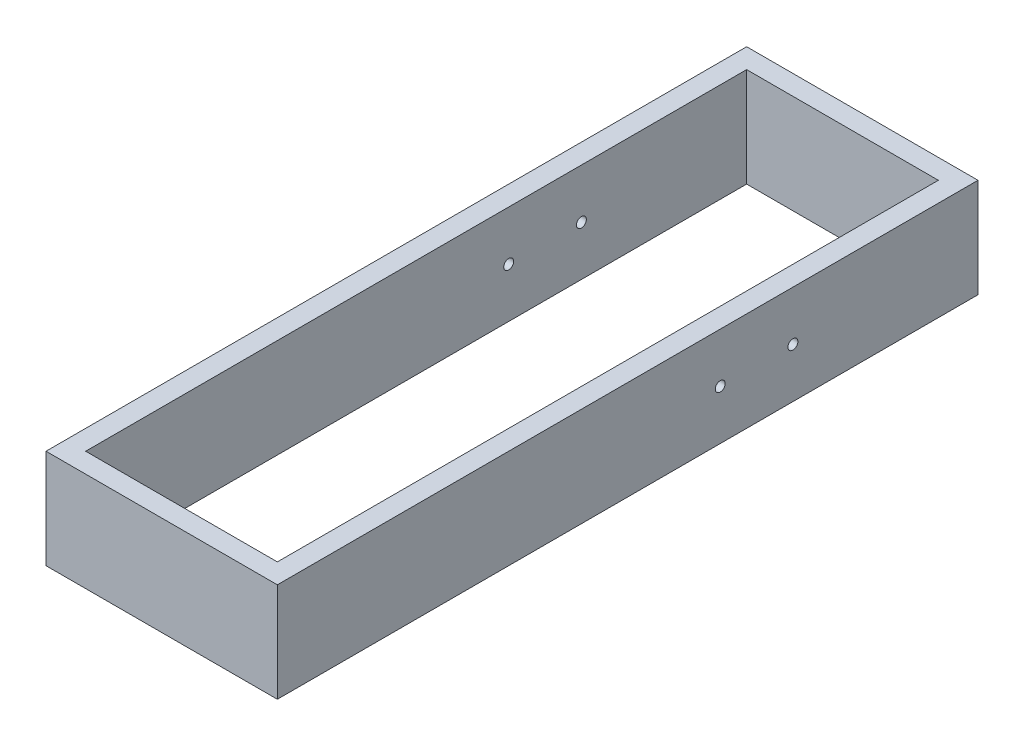
ISO-10303-21;
HEADER;
FILE_DESCRIPTION(('STEP AP214'),'2;1');
FILE_NAME('part.step','',(''),(''),'','','');
FILE_SCHEMA(('AUTOMOTIVE_DESIGN { 1 0 10303 214 1 1 1 1 }'));
ENDSEC;
DATA;
#1=APPLICATION_CONTEXT('core data for automotive mechanical design processes');
#2=APPLICATION_PROTOCOL_DEFINITION('international standard','automotive_design',2000,#1);
#3=PRODUCT_CONTEXT('',#1,'mechanical');
#4=PRODUCT('Part','Part','',(#3));
#5=PRODUCT_RELATED_PRODUCT_CATEGORY('part','',(#4));
#6=PRODUCT_DEFINITION_FORMATION('','',#4);
#7=PRODUCT_DEFINITION_CONTEXT('part definition',#1,'design');
#8=PRODUCT_DEFINITION('design','',#6,#7);
#9=PRODUCT_DEFINITION_SHAPE('','',#8);
#10=(LENGTH_UNIT() NAMED_UNIT(*) SI_UNIT(.MILLI.,.METRE.));
#11=(NAMED_UNIT(*) PLANE_ANGLE_UNIT() SI_UNIT($,.RADIAN.));
#12=(NAMED_UNIT(*) SI_UNIT($,.STERADIAN.) SOLID_ANGLE_UNIT());
#13=UNCERTAINTY_MEASURE_WITH_UNIT(LENGTH_MEASURE(1.E-05),#10,'distance_accuracy_value','');
#14=(GEOMETRIC_REPRESENTATION_CONTEXT(3) GLOBAL_UNCERTAINTY_ASSIGNED_CONTEXT((#13)) GLOBAL_UNIT_ASSIGNED_CONTEXT((#10,
#11,#12)) REPRESENTATION_CONTEXT('',''));
#15=CARTESIAN_POINT('',(0.,0.,0.));
#16=DIRECTION('',(0.,0.,1.));
#17=DIRECTION('',(1.,0.,0.));
#18=AXIS2_PLACEMENT_3D('',#15,#16,#17);
#19=CARTESIAN_POINT('',(0.,30.,0.));
#20=DIRECTION('',(0.,1.,0.));
#21=DIRECTION('',(0.,0.,1.));
#22=AXIS2_PLACEMENT_3D('',#19,#20,#21);
#23=PLANE('',#22);
#24=DIRECTION('',(0.,0.,-1.));
#25=VECTOR('',#24,1.);
#26=CARTESIAN_POINT('',(35.,30.,-106.));
#27=LINE('',#26,#25);
#28=CARTESIAN_POINT('',(35.,30.,106.));
#29=VERTEX_POINT('',#28);
#30=CARTESIAN_POINT('',(35.,30.,-106.));
#31=VERTEX_POINT('',#30);
#32=EDGE_CURVE('E140',#29,#31,#27,.T.);
#33=ORIENTED_EDGE('',*,*,#32,.T.);
#34=DIRECTION('',(-1.,0.,0.));
#35=VECTOR('',#34,1.);
#36=CARTESIAN_POINT('',(-35.,30.,-106.));
#37=LINE('',#36,#35);
#38=CARTESIAN_POINT('',(-35.,30.,-106.));
#39=VERTEX_POINT('',#38);
#40=EDGE_CURVE('E143',#31,#39,#37,.T.);
#41=ORIENTED_EDGE('',*,*,#40,.T.);
#42=DIRECTION('',(0.,0.,1.));
#43=VECTOR('',#42,1.);
#44=CARTESIAN_POINT('',(-35.,30.,-106.));
#45=LINE('',#44,#43);
#46=CARTESIAN_POINT('',(-35.,30.,106.));
#47=VERTEX_POINT('',#46);
#48=EDGE_CURVE('E146',#39,#47,#45,.T.);
#49=ORIENTED_EDGE('',*,*,#48,.T.);
#50=DIRECTION('',(1.,0.,0.));
#51=VECTOR('',#50,1.);
#52=CARTESIAN_POINT('',(-35.,30.,106.));
#53=LINE('',#52,#51);
#54=EDGE_CURVE('E148',#47,#29,#53,.T.);
#55=ORIENTED_EDGE('',*,*,#54,.T.);
#56=EDGE_LOOP('',(#33,#41,#49,#55));
#57=FACE_BOUND('',#56,.T.);
#58=DIRECTION('',(-1.,0.,0.));
#59=VECTOR('',#58,1.);
#60=CARTESIAN_POINT('',(-29.,30.,-100.));
#61=LINE('',#60,#59);
#62=CARTESIAN_POINT('',(29.,30.,-100.));
#63=VERTEX_POINT('',#62);
#64=CARTESIAN_POINT('',(-29.,30.,-100.));
#65=VERTEX_POINT('',#64);
#66=EDGE_CURVE('E110',#63,#65,#61,.T.);
#67=ORIENTED_EDGE('',*,*,#66,.F.);
#68=DIRECTION('',(0.,0.,-1.));
#69=VECTOR('',#68,1.);
#70=CARTESIAN_POINT('',(29.,30.,-100.));
#71=LINE('',#70,#69);
#72=CARTESIAN_POINT('',(29.,30.,100.));
#73=VERTEX_POINT('',#72);
#74=EDGE_CURVE('E102',#73,#63,#71,.T.);
#75=ORIENTED_EDGE('',*,*,#74,.F.);
#76=DIRECTION('',(1.,0.,0.));
#77=VECTOR('',#76,1.);
#78=CARTESIAN_POINT('',(-29.,30.,100.));
#79=LINE('',#78,#77);
#80=CARTESIAN_POINT('',(-29.,30.,100.));
#81=VERTEX_POINT('',#80);
#82=EDGE_CURVE('E124',#81,#73,#79,.T.);
#83=ORIENTED_EDGE('',*,*,#82,.F.);
#84=DIRECTION('',(0.,0.,1.));
#85=VECTOR('',#84,1.);
#86=CARTESIAN_POINT('',(-29.,30.,-100.));
#87=LINE('',#86,#85);
#88=EDGE_CURVE('E122',#65,#81,#87,.T.);
#89=ORIENTED_EDGE('',*,*,#88,.F.);
#90=EDGE_LOOP('',(#67,#75,#83,#89));
#91=FACE_BOUND('',#90,.T.);
#92=ADVANCED_FACE('F35',(#57,#91),#23,.T.);
#93=CARTESIAN_POINT('',(0.,0.,0.));
#94=DIRECTION('',(0.,1.,0.));
#95=DIRECTION('',(0.,0.,1.));
#96=AXIS2_PLACEMENT_3D('',#93,#94,#95);
#97=PLANE('',#96);
#98=DIRECTION('',(0.,0.,-1.));
#99=VECTOR('',#98,1.);
#100=CARTESIAN_POINT('',(35.,0.,-106.));
#101=LINE('',#100,#99);
#102=CARTESIAN_POINT('',(35.,0.,106.));
#103=VERTEX_POINT('',#102);
#104=CARTESIAN_POINT('',(35.,0.,-106.));
#105=VERTEX_POINT('',#104);
#106=EDGE_CURVE('E118',#103,#105,#101,.T.);
#107=ORIENTED_EDGE('',*,*,#106,.F.);
#108=DIRECTION('',(1.,0.,0.));
#109=VECTOR('',#108,1.);
#110=CARTESIAN_POINT('',(-35.,0.,106.));
#111=LINE('',#110,#109);
#112=CARTESIAN_POINT('',(-35.,0.,106.));
#113=VERTEX_POINT('',#112);
#114=EDGE_CURVE('E144',#113,#103,#111,.T.);
#115=ORIENTED_EDGE('',*,*,#114,.F.);
#116=DIRECTION('',(0.,0.,1.));
#117=VECTOR('',#116,1.);
#118=CARTESIAN_POINT('',(-35.,0.,-106.));
#119=LINE('',#118,#117);
#120=CARTESIAN_POINT('',(-35.,0.,-106.));
#121=VERTEX_POINT('',#120);
#122=EDGE_CURVE('E155',#121,#113,#119,.T.);
#123=ORIENTED_EDGE('',*,*,#122,.F.);
#124=DIRECTION('',(-1.,0.,0.));
#125=VECTOR('',#124,1.);
#126=CARTESIAN_POINT('',(-35.,0.,-106.));
#127=LINE('',#126,#125);
#128=EDGE_CURVE('E153',#105,#121,#127,.T.);
#129=ORIENTED_EDGE('',*,*,#128,.F.);
#130=EDGE_LOOP('',(#107,#115,#123,#129));
#131=FACE_BOUND('',#130,.T.);
#132=DIRECTION('',(0.,0.,-1.));
#133=VECTOR('',#132,1.);
#134=CARTESIAN_POINT('',(29.,0.,-100.));
#135=LINE('',#134,#133);
#136=CARTESIAN_POINT('',(29.,0.,100.));
#137=VERTEX_POINT('',#136);
#138=CARTESIAN_POINT('',(29.,0.,-100.));
#139=VERTEX_POINT('',#138);
#140=EDGE_CURVE('E60',#137,#139,#135,.T.);
#141=ORIENTED_EDGE('',*,*,#140,.T.);
#142=DIRECTION('',(-1.,0.,0.));
#143=VECTOR('',#142,1.);
#144=CARTESIAN_POINT('',(-29.,0.,-100.));
#145=LINE('',#144,#143);
#146=CARTESIAN_POINT('',(-29.,0.,-100.));
#147=VERTEX_POINT('',#146);
#148=EDGE_CURVE('E117',#139,#147,#145,.T.);
#149=ORIENTED_EDGE('',*,*,#148,.T.);
#150=DIRECTION('',(0.,0.,1.));
#151=VECTOR('',#150,1.);
#152=CARTESIAN_POINT('',(-29.,0.,-100.));
#153=LINE('',#152,#151);
#154=CARTESIAN_POINT('',(-29.,0.,100.));
#155=VERTEX_POINT('',#154);
#156=EDGE_CURVE('E132',#147,#155,#153,.T.);
#157=ORIENTED_EDGE('',*,*,#156,.T.);
#158=DIRECTION('',(1.,0.,0.));
#159=VECTOR('',#158,1.);
#160=CARTESIAN_POINT('',(-29.,0.,100.));
#161=LINE('',#160,#159);
#162=EDGE_CURVE('E111',#155,#137,#161,.T.);
#163=ORIENTED_EDGE('',*,*,#162,.T.);
#164=EDGE_LOOP('',(#141,#149,#157,#163));
#165=FACE_BOUND('',#164,.T.);
#166=ADVANCED_FACE('F202',(#131,#165),#97,.F.);
#167=CARTESIAN_POINT('',(35.,30.,-106.));
#168=DIRECTION('',(-1.,0.,0.));
#169=DIRECTION('',(0.,0.,1.));
#170=AXIS2_PLACEMENT_3D('',#167,#168,#169);
#171=PLANE('',#170);
#172=CARTESIAN_POINT('',(35.,15.,-50.));
#173=DIRECTION('',(1.,0.,0.));
#174=DIRECTION('',(0.,0.,-1.));
#175=AXIS2_PLACEMENT_3D('',#172,#173,#174);
#176=CIRCLE('',#175,1.5);
#177=CARTESIAN_POINT('',(35.,15.,-51.5));
#178=VERTEX_POINT('',#177);
#179=EDGE_CURVE('E173',#178,#178,#176,.T.);
#180=ORIENTED_EDGE('',*,*,#179,.F.);
#181=EDGE_LOOP('',(#180));
#182=FACE_BOUND('',#181,.T.);
#183=CARTESIAN_POINT('',(35.,15.,-28.));
#184=DIRECTION('',(1.,0.,0.));
#185=DIRECTION('',(0.,0.,-1.));
#186=AXIS2_PLACEMENT_3D('',#183,#184,#185);
#187=CIRCLE('',#186,1.5);
#188=CARTESIAN_POINT('',(35.,15.,-29.5));
#189=VERTEX_POINT('',#188);
#190=EDGE_CURVE('E183',#189,#189,#187,.T.);
#191=ORIENTED_EDGE('',*,*,#190,.F.);
#192=EDGE_LOOP('',(#191));
#193=FACE_BOUND('',#192,.T.);
#194=ORIENTED_EDGE('',*,*,#106,.T.);
#195=DIRECTION('',(0.,-1.,0.));
#196=VECTOR('',#195,1.);
#197=CARTESIAN_POINT('',(35.,30.,-106.));
#198=LINE('',#197,#196);
#199=EDGE_CURVE('E11',#31,#105,#198,.T.);
#200=ORIENTED_EDGE('',*,*,#199,.F.);
#201=ORIENTED_EDGE('',*,*,#32,.F.);
#202=DIRECTION('',(0.,-1.,0.));
#203=VECTOR('',#202,1.);
#204=CARTESIAN_POINT('',(35.,30.,106.));
#205=LINE('',#204,#203);
#206=EDGE_CURVE('E150',#29,#103,#205,.T.);
#207=ORIENTED_EDGE('',*,*,#206,.T.);
#208=EDGE_LOOP('',(#194,#200,#201,#207));
#209=FACE_BOUND('',#208,.T.);
#210=ADVANCED_FACE('F37',(#182,#193,#209),#171,.F.);
#211=CARTESIAN_POINT('',(-35.,30.,-106.));
#212=DIRECTION('',(0.,0.,1.));
#213=DIRECTION('',(1.,0.,0.));
#214=AXIS2_PLACEMENT_3D('',#211,#212,#213);
#215=PLANE('',#214);
#216=ORIENTED_EDGE('',*,*,#128,.T.);
#217=DIRECTION('',(0.,-1.,0.));
#218=VECTOR('',#217,1.);
#219=CARTESIAN_POINT('',(-35.,30.,-106.));
#220=LINE('',#219,#218);
#221=EDGE_CURVE('E44',#39,#121,#220,.T.);
#222=ORIENTED_EDGE('',*,*,#221,.F.);
#223=ORIENTED_EDGE('',*,*,#40,.F.);
#224=ORIENTED_EDGE('',*,*,#199,.T.);
#225=EDGE_LOOP('',(#216,#222,#223,#224));
#226=FACE_BOUND('',#225,.T.);
#227=ADVANCED_FACE('F228',(#226),#215,.F.);
#228=CARTESIAN_POINT('',(-35.,30.,-106.));
#229=DIRECTION('',(1.,0.,0.));
#230=DIRECTION('',(0.,0.,-1.));
#231=AXIS2_PLACEMENT_3D('',#228,#229,#230);
#232=PLANE('',#231);
#233=CARTESIAN_POINT('',(-35.,15.,-50.));
#234=DIRECTION('',(1.,0.,0.));
#235=DIRECTION('',(0.,0.,-1.));
#236=AXIS2_PLACEMENT_3D('',#233,#234,#235);
#237=CIRCLE('',#236,1.5);
#238=CARTESIAN_POINT('',(-35.,15.,-51.5));
#239=VERTEX_POINT('',#238);
#240=EDGE_CURVE('E167',#239,#239,#237,.T.);
#241=ORIENTED_EDGE('',*,*,#240,.T.);
#242=EDGE_LOOP('',(#241));
#243=FACE_BOUND('',#242,.T.);
#244=CARTESIAN_POINT('',(-35.,15.,-28.));
#245=DIRECTION('',(1.,0.,0.));
#246=DIRECTION('',(0.,0.,-1.));
#247=AXIS2_PLACEMENT_3D('',#244,#245,#246);
#248=CIRCLE('',#247,1.5);
#249=CARTESIAN_POINT('',(-35.,15.,-29.5));
#250=VERTEX_POINT('',#249);
#251=EDGE_CURVE('E178',#250,#250,#248,.T.);
#252=ORIENTED_EDGE('',*,*,#251,.T.);
#253=EDGE_LOOP('',(#252));
#254=FACE_BOUND('',#253,.T.);
#255=ORIENTED_EDGE('',*,*,#122,.T.);
#256=DIRECTION('',(0.,-1.,0.));
#257=VECTOR('',#256,1.);
#258=CARTESIAN_POINT('',(-35.,30.,106.));
#259=LINE('',#258,#257);
#260=EDGE_CURVE('E160',#47,#113,#259,.T.);
#261=ORIENTED_EDGE('',*,*,#260,.F.);
#262=ORIENTED_EDGE('',*,*,#48,.F.);
#263=ORIENTED_EDGE('',*,*,#221,.T.);
#264=EDGE_LOOP('',(#255,#261,#262,#263));
#265=FACE_BOUND('',#264,.T.);
#266=ADVANCED_FACE('F225',(#243,#254,#265),#232,.F.);
#267=CARTESIAN_POINT('',(-35.,30.,106.));
#268=DIRECTION('',(0.,0.,-1.));
#269=DIRECTION('',(-1.,0.,0.));
#270=AXIS2_PLACEMENT_3D('',#267,#268,#269);
#271=PLANE('',#270);
#272=ORIENTED_EDGE('',*,*,#114,.T.);
#273=ORIENTED_EDGE('',*,*,#206,.F.);
#274=ORIENTED_EDGE('',*,*,#54,.F.);
#275=ORIENTED_EDGE('',*,*,#260,.T.);
#276=EDGE_LOOP('',(#272,#273,#274,#275));
#277=FACE_BOUND('',#276,.T.);
#278=ADVANCED_FACE('F222',(#277),#271,.F.);
#279=CARTESIAN_POINT('',(29.,30.,-100.));
#280=DIRECTION('',(-1.,0.,0.));
#281=DIRECTION('',(0.,0.,1.));
#282=AXIS2_PLACEMENT_3D('',#279,#280,#281);
#283=PLANE('',#282);
#284=CARTESIAN_POINT('',(29.,15.,-50.));
#285=DIRECTION('',(-1.,0.,0.));
#286=DIRECTION('',(0.,0.,1.));
#287=AXIS2_PLACEMENT_3D('',#284,#285,#286);
#288=CIRCLE('',#287,1.5);
#289=CARTESIAN_POINT('',(29.,15.,-48.5));
#290=VERTEX_POINT('',#289);
#291=EDGE_CURVE('E130',#290,#290,#288,.T.);
#292=ORIENTED_EDGE('',*,*,#291,.F.);
#293=EDGE_LOOP('',(#292));
#294=FACE_BOUND('',#293,.T.);
#295=CARTESIAN_POINT('',(29.,15.,-28.));
#296=DIRECTION('',(-1.,0.,0.));
#297=DIRECTION('',(0.,0.,1.));
#298=AXIS2_PLACEMENT_3D('',#295,#296,#297);
#299=CIRCLE('',#298,1.5);
#300=CARTESIAN_POINT('',(29.,15.,-26.5));
#301=VERTEX_POINT('',#300);
#302=EDGE_CURVE('E166',#301,#301,#299,.T.);
#303=ORIENTED_EDGE('',*,*,#302,.F.);
#304=EDGE_LOOP('',(#303));
#305=FACE_BOUND('',#304,.T.);
#306=ORIENTED_EDGE('',*,*,#140,.F.);
#307=DIRECTION('',(0.,-1.,0.));
#308=VECTOR('',#307,1.);
#309=CARTESIAN_POINT('',(29.,30.,100.));
#310=LINE('',#309,#308);
#311=EDGE_CURVE('E106',#73,#137,#310,.T.);
#312=ORIENTED_EDGE('',*,*,#311,.F.);
#313=ORIENTED_EDGE('',*,*,#74,.T.);
#314=DIRECTION('',(0.,-1.,0.));
#315=VECTOR('',#314,1.);
#316=CARTESIAN_POINT('',(29.,30.,-100.));
#317=LINE('',#316,#315);
#318=EDGE_CURVE('E105',#63,#139,#317,.T.);
#319=ORIENTED_EDGE('',*,*,#318,.T.);
#320=EDGE_LOOP('',(#306,#312,#313,#319));
#321=FACE_BOUND('',#320,.T.);
#322=ADVANCED_FACE('F104',(#294,#305,#321),#283,.T.);
#323=CARTESIAN_POINT('',(-29.,30.,-100.));
#324=DIRECTION('',(0.,0.,1.));
#325=DIRECTION('',(1.,0.,0.));
#326=AXIS2_PLACEMENT_3D('',#323,#324,#325);
#327=PLANE('',#326);
#328=ORIENTED_EDGE('',*,*,#148,.F.);
#329=ORIENTED_EDGE('',*,*,#318,.F.);
#330=ORIENTED_EDGE('',*,*,#66,.T.);
#331=DIRECTION('',(0.,-1.,0.));
#332=VECTOR('',#331,1.);
#333=CARTESIAN_POINT('',(-29.,30.,-100.));
#334=LINE('',#333,#332);
#335=EDGE_CURVE('E119',#65,#147,#334,.T.);
#336=ORIENTED_EDGE('',*,*,#335,.T.);
#337=EDGE_LOOP('',(#328,#329,#330,#336));
#338=FACE_BOUND('',#337,.T.);
#339=ADVANCED_FACE('F114',(#338),#327,.T.);
#340=CARTESIAN_POINT('',(-29.,30.,-100.));
#341=DIRECTION('',(1.,0.,0.));
#342=DIRECTION('',(0.,0.,-1.));
#343=AXIS2_PLACEMENT_3D('',#340,#341,#342);
#344=PLANE('',#343);
#345=CARTESIAN_POINT('',(-29.,15.,-50.));
#346=DIRECTION('',(1.,0.,0.));
#347=DIRECTION('',(0.,0.,-1.));
#348=AXIS2_PLACEMENT_3D('',#345,#346,#347);
#349=CIRCLE('',#348,1.5);
#350=CARTESIAN_POINT('',(-29.,15.,-51.5));
#351=VERTEX_POINT('',#350);
#352=EDGE_CURVE('E39',#351,#351,#349,.T.);
#353=ORIENTED_EDGE('',*,*,#352,.F.);
#354=EDGE_LOOP('',(#353));
#355=FACE_BOUND('',#354,.T.);
#356=CARTESIAN_POINT('',(-29.,15.,-28.));
#357=DIRECTION('',(1.,0.,0.));
#358=DIRECTION('',(0.,0.,-1.));
#359=AXIS2_PLACEMENT_3D('',#356,#357,#358);
#360=CIRCLE('',#359,1.5);
#361=CARTESIAN_POINT('',(-29.,15.,-29.5));
#362=VERTEX_POINT('',#361);
#363=EDGE_CURVE('E164',#362,#362,#360,.T.);
#364=ORIENTED_EDGE('',*,*,#363,.F.);
#365=EDGE_LOOP('',(#364));
#366=FACE_BOUND('',#365,.T.);
#367=ORIENTED_EDGE('',*,*,#156,.F.);
#368=ORIENTED_EDGE('',*,*,#335,.F.);
#369=ORIENTED_EDGE('',*,*,#88,.T.);
#370=DIRECTION('',(0.,-1.,0.));
#371=VECTOR('',#370,1.);
#372=CARTESIAN_POINT('',(-29.,30.,100.));
#373=LINE('',#372,#371);
#374=EDGE_CURVE('E52',#81,#155,#373,.T.);
#375=ORIENTED_EDGE('',*,*,#374,.T.);
#376=EDGE_LOOP('',(#367,#368,#369,#375));
#377=FACE_BOUND('',#376,.T.);
#378=ADVANCED_FACE('F194',(#355,#366,#377),#344,.T.);
#379=CARTESIAN_POINT('',(-29.,30.,100.));
#380=DIRECTION('',(0.,0.,-1.));
#381=DIRECTION('',(-1.,0.,0.));
#382=AXIS2_PLACEMENT_3D('',#379,#380,#381);
#383=PLANE('',#382);
#384=ORIENTED_EDGE('',*,*,#162,.F.);
#385=ORIENTED_EDGE('',*,*,#374,.F.);
#386=ORIENTED_EDGE('',*,*,#82,.T.);
#387=ORIENTED_EDGE('',*,*,#311,.T.);
#388=EDGE_LOOP('',(#384,#385,#386,#387));
#389=FACE_BOUND('',#388,.T.);
#390=ADVANCED_FACE('F197',(#389),#383,.T.);
#391=CARTESIAN_POINT('',(-35.,15.,-28.));
#392=DIRECTION('',(1.,0.,0.));
#393=DIRECTION('',(0.,0.,-1.));
#394=AXIS2_PLACEMENT_3D('',#391,#392,#393);
#395=CYLINDRICAL_SURFACE('',#394,1.5);
#396=ORIENTED_EDGE('',*,*,#363,.T.);
#397=EDGE_LOOP('',(#396));
#398=FACE_BOUND('',#397,.T.);
#399=ORIENTED_EDGE('',*,*,#251,.F.);
#400=EDGE_LOOP('',(#399));
#401=FACE_BOUND('',#400,.T.);
#402=ADVANCED_FACE('F204',(#398,#401),#395,.F.);
#403=CARTESIAN_POINT('',(-35.,15.,-50.));
#404=DIRECTION('',(1.,0.,0.));
#405=DIRECTION('',(0.,0.,-1.));
#406=AXIS2_PLACEMENT_3D('',#403,#404,#405);
#407=CYLINDRICAL_SURFACE('',#406,1.5);
#408=ORIENTED_EDGE('',*,*,#352,.T.);
#409=EDGE_LOOP('',(#408));
#410=FACE_BOUND('',#409,.T.);
#411=ORIENTED_EDGE('',*,*,#240,.F.);
#412=EDGE_LOOP('',(#411));
#413=FACE_BOUND('',#412,.T.);
#414=ADVANCED_FACE('F191',(#410,#413),#407,.F.);
#415=ORIENTED_EDGE('',*,*,#302,.T.);
#416=EDGE_LOOP('',(#415));
#417=FACE_BOUND('',#416,.T.);
#418=ORIENTED_EDGE('',*,*,#190,.T.);
#419=EDGE_LOOP('',(#418));
#420=FACE_BOUND('',#419,.T.);
#421=ADVANCED_FACE('F210',(#417,#420),#395,.F.);
#422=ORIENTED_EDGE('',*,*,#291,.T.);
#423=EDGE_LOOP('',(#422));
#424=FACE_BOUND('',#423,.T.);
#425=ORIENTED_EDGE('',*,*,#179,.T.);
#426=EDGE_LOOP('',(#425));
#427=FACE_BOUND('',#426,.T.);
#428=ADVANCED_FACE('F254',(#424,#427),#407,.F.);
#429=CLOSED_SHELL('',(#92,#166,#210,#227,#266,#278,#322,#339,#378,#390,#402,#414,#421,#428));
#430=MANIFOLD_SOLID_BREP('B2',#429);
#431=ADVANCED_BREP_SHAPE_REPRESENTATION('',(#18,#430),#14);
#432=SHAPE_DEFINITION_REPRESENTATION(#9,#431);
ENDSEC;
END-ISO-10303-21;
